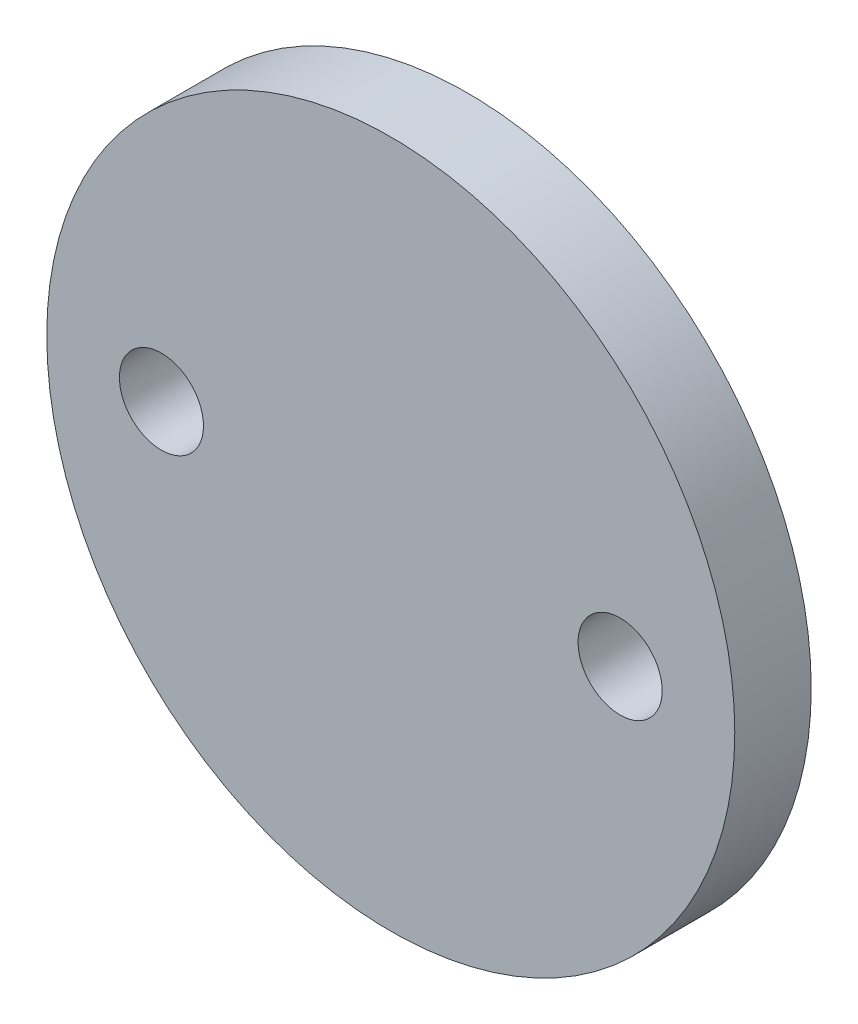
ISO-10303-21;
HEADER;
FILE_DESCRIPTION(('STEP AP214'),'2;1');
FILE_NAME('part.step','',(''),(''),'','','');
FILE_SCHEMA(('AUTOMOTIVE_DESIGN { 1 0 10303 214 1 1 1 1 }'));
ENDSEC;
DATA;
#1=APPLICATION_CONTEXT('core data for automotive mechanical design processes');
#2=APPLICATION_PROTOCOL_DEFINITION('international standard','automotive_design',2000,#1);
#3=PRODUCT_CONTEXT('',#1,'mechanical');
#4=PRODUCT('Part','Part','',(#3));
#5=PRODUCT_RELATED_PRODUCT_CATEGORY('part','',(#4));
#6=PRODUCT_DEFINITION_FORMATION('','',#4);
#7=PRODUCT_DEFINITION_CONTEXT('part definition',#1,'design');
#8=PRODUCT_DEFINITION('design','',#6,#7);
#9=PRODUCT_DEFINITION_SHAPE('','',#8);
#10=(LENGTH_UNIT() NAMED_UNIT(*) SI_UNIT(.MILLI.,.METRE.));
#11=(NAMED_UNIT(*) PLANE_ANGLE_UNIT() SI_UNIT($,.RADIAN.));
#12=(NAMED_UNIT(*) SI_UNIT($,.STERADIAN.) SOLID_ANGLE_UNIT());
#13=UNCERTAINTY_MEASURE_WITH_UNIT(LENGTH_MEASURE(1.E-05),#10,'distance_accuracy_value','');
#14=(GEOMETRIC_REPRESENTATION_CONTEXT(3) GLOBAL_UNCERTAINTY_ASSIGNED_CONTEXT((#13)) GLOBAL_UNIT_ASSIGNED_CONTEXT((#10,
#11,#12)) REPRESENTATION_CONTEXT('',''));
#15=CARTESIAN_POINT('',(0.,0.,0.));
#16=DIRECTION('',(0.,0.,1.));
#17=DIRECTION('',(1.,0.,0.));
#18=AXIS2_PLACEMENT_3D('',#15,#16,#17);
#19=CARTESIAN_POINT('',(-8.8847886,0.,2.));
#20=DIRECTION('',(0.,0.,1.));
#21=DIRECTION('',(1.,0.,0.));
#22=AXIS2_PLACEMENT_3D('',#19,#20,#21);
#23=PLANE('',#22);
#24=CARTESIAN_POINT('',(-14.8847886,0.,2.));
#25=DIRECTION('',(0.,0.,1.));
#26=DIRECTION('',(1.,0.,0.));
#27=AXIS2_PLACEMENT_3D('',#24,#25,#26);
#28=CIRCLE('',#27,1.1);
#29=CARTESIAN_POINT('',(-13.7847886,0.,2.));
#30=VERTEX_POINT('',#29);
#31=EDGE_CURVE('E50',#30,#30,#28,.T.);
#32=ORIENTED_EDGE('',*,*,#31,.F.);
#33=EDGE_LOOP('',(#32));
#34=FACE_BOUND('',#33,.T.);
#35=CARTESIAN_POINT('',(-8.8847886,0.,2.));
#36=DIRECTION('',(0.,0.,1.));
#37=DIRECTION('',(1.,0.,0.));
#38=AXIS2_PLACEMENT_3D('',#35,#36,#37);
#39=CIRCLE('',#38,9.);
#40=CARTESIAN_POINT('',(0.115211399999995,0.,2.));
#41=VERTEX_POINT('',#40);
#42=EDGE_CURVE('E10',#41,#41,#39,.T.);
#43=ORIENTED_EDGE('',*,*,#42,.T.);
#44=EDGE_LOOP('',(#43));
#45=FACE_BOUND('',#44,.T.);
#46=CARTESIAN_POINT('',(-2.8847886,0.,2.));
#47=DIRECTION('',(0.,0.,1.));
#48=DIRECTION('',(1.,0.,0.));
#49=AXIS2_PLACEMENT_3D('',#46,#47,#48);
#50=CIRCLE('',#49,1.1);
#51=CARTESIAN_POINT('',(-1.7847886,0.,2.));
#52=VERTEX_POINT('',#51);
#53=EDGE_CURVE('E56',#52,#52,#50,.T.);
#54=ORIENTED_EDGE('',*,*,#53,.F.);
#55=EDGE_LOOP('',(#54));
#56=FACE_BOUND('',#55,.T.);
#57=ADVANCED_FACE('F37',(#34,#45,#56),#23,.T.);
#58=CARTESIAN_POINT('',(-8.8847886,0.,0.));
#59=DIRECTION('',(0.,0.,1.));
#60=DIRECTION('',(1.,0.,0.));
#61=AXIS2_PLACEMENT_3D('',#58,#59,#60);
#62=PLANE('',#61);
#63=CARTESIAN_POINT('',(-8.8847886,0.,0.));
#64=DIRECTION('',(0.,0.,1.));
#65=DIRECTION('',(1.,0.,0.));
#66=AXIS2_PLACEMENT_3D('',#63,#64,#65);
#67=CIRCLE('',#66,9.);
#68=CARTESIAN_POINT('',(0.115211399999995,0.,0.));
#69=VERTEX_POINT('',#68);
#70=EDGE_CURVE('E41',#69,#69,#67,.T.);
#71=ORIENTED_EDGE('',*,*,#70,.F.);
#72=EDGE_LOOP('',(#71));
#73=FACE_BOUND('',#72,.T.);
#74=CARTESIAN_POINT('',(-14.8847886,0.,0.));
#75=DIRECTION('',(0.,0.,1.));
#76=DIRECTION('',(1.,0.,0.));
#77=AXIS2_PLACEMENT_3D('',#74,#75,#76);
#78=CIRCLE('',#77,1.1);
#79=CARTESIAN_POINT('',(-13.7847886,0.,0.));
#80=VERTEX_POINT('',#79);
#81=EDGE_CURVE('E52',#80,#80,#78,.T.);
#82=ORIENTED_EDGE('',*,*,#81,.T.);
#83=EDGE_LOOP('',(#82));
#84=FACE_BOUND('',#83,.T.);
#85=CARTESIAN_POINT('',(-2.8847886,0.,0.));
#86=DIRECTION('',(0.,0.,1.));
#87=DIRECTION('',(1.,0.,0.));
#88=AXIS2_PLACEMENT_3D('',#85,#86,#87);
#89=CIRCLE('',#88,1.1);
#90=CARTESIAN_POINT('',(-1.7847886,0.,0.));
#91=VERTEX_POINT('',#90);
#92=EDGE_CURVE('E60',#91,#91,#89,.T.);
#93=ORIENTED_EDGE('',*,*,#92,.T.);
#94=EDGE_LOOP('',(#93));
#95=FACE_BOUND('',#94,.T.);
#96=ADVANCED_FACE('F72',(#73,#84,#95),#62,.F.);
#97=CARTESIAN_POINT('',(-8.8847886,0.,2.));
#98=DIRECTION('',(0.,0.,-1.));
#99=DIRECTION('',(-1.,0.,0.));
#100=AXIS2_PLACEMENT_3D('',#97,#98,#99);
#101=CYLINDRICAL_SURFACE('',#100,9.);
#102=ORIENTED_EDGE('',*,*,#42,.F.);
#103=EDGE_LOOP('',(#102));
#104=FACE_BOUND('',#103,.T.);
#105=ORIENTED_EDGE('',*,*,#70,.T.);
#106=EDGE_LOOP('',(#105));
#107=FACE_BOUND('',#106,.T.);
#108=ADVANCED_FACE('F39',(#104,#107),#101,.T.);
#109=CARTESIAN_POINT('',(-14.8847886,0.,2.));
#110=DIRECTION('',(0.,0.,-1.));
#111=DIRECTION('',(-1.,0.,0.));
#112=AXIS2_PLACEMENT_3D('',#109,#110,#111);
#113=CYLINDRICAL_SURFACE('',#112,1.1);
#114=ORIENTED_EDGE('',*,*,#31,.T.);
#115=EDGE_LOOP('',(#114));
#116=FACE_BOUND('',#115,.T.);
#117=ORIENTED_EDGE('',*,*,#81,.F.);
#118=EDGE_LOOP('',(#117));
#119=FACE_BOUND('',#118,.T.);
#120=ADVANCED_FACE('F81',(#116,#119),#113,.F.);
#121=CARTESIAN_POINT('',(-2.8847886,0.,2.));
#122=DIRECTION('',(0.,0.,-1.));
#123=DIRECTION('',(-1.,0.,0.));
#124=AXIS2_PLACEMENT_3D('',#121,#122,#123);
#125=CYLINDRICAL_SURFACE('',#124,1.1);
#126=ORIENTED_EDGE('',*,*,#53,.T.);
#127=EDGE_LOOP('',(#126));
#128=FACE_BOUND('',#127,.T.);
#129=ORIENTED_EDGE('',*,*,#92,.F.);
#130=EDGE_LOOP('',(#129));
#131=FACE_BOUND('',#130,.T.);
#132=ADVANCED_FACE('F68',(#128,#131),#125,.F.);
#133=CLOSED_SHELL('',(#57,#96,#108,#120,#132));
#134=MANIFOLD_SOLID_BREP('B2',#133);
#135=ADVANCED_BREP_SHAPE_REPRESENTATION('',(#18,#134),#14);
#136=SHAPE_DEFINITION_REPRESENTATION(#9,#135);
ENDSEC;
END-ISO-10303-21;
